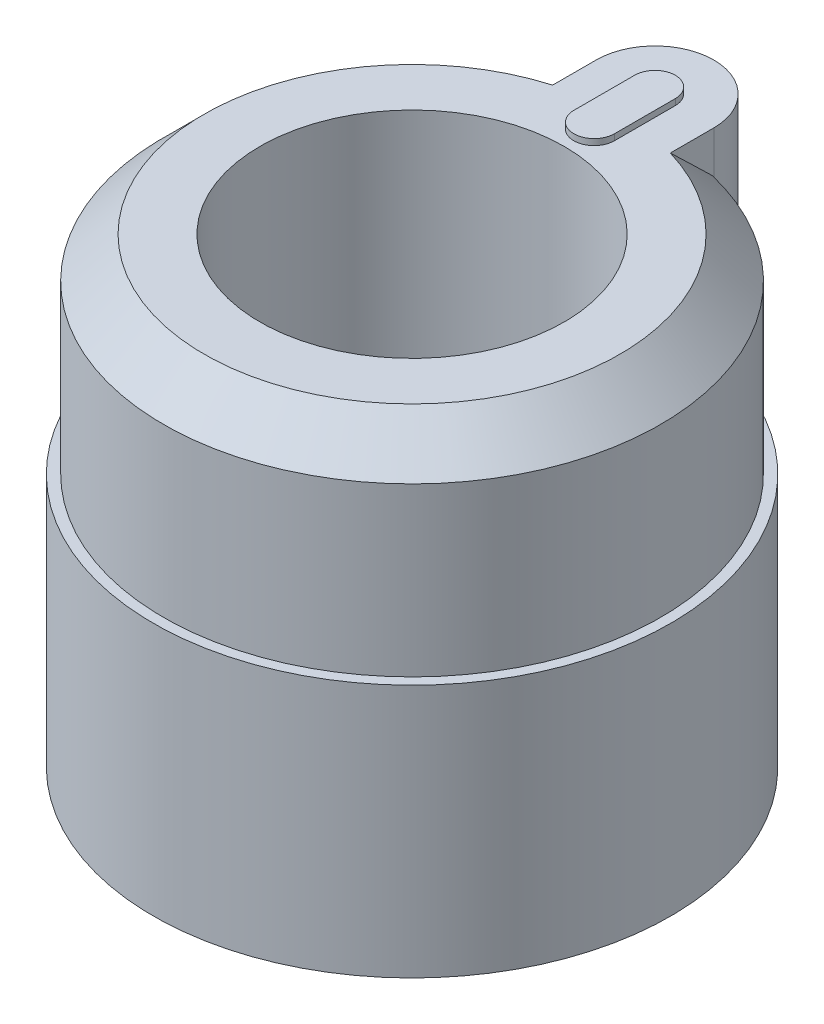
ISO-10303-21;
HEADER;
FILE_DESCRIPTION(('STEP AP214'),'2;1');
FILE_NAME('part.step','',(''),(''),'','','');
FILE_SCHEMA(('AUTOMOTIVE_DESIGN { 1 0 10303 214 1 1 1 1 }'));
ENDSEC;
DATA;
#1=APPLICATION_CONTEXT('core data for automotive mechanical design processes');
#2=APPLICATION_PROTOCOL_DEFINITION('international standard','automotive_design',2000,#1);
#3=PRODUCT_CONTEXT('',#1,'mechanical');
#4=PRODUCT('Part','Part','',(#3));
#5=PRODUCT_RELATED_PRODUCT_CATEGORY('part','',(#4));
#6=PRODUCT_DEFINITION_FORMATION('','',#4);
#7=PRODUCT_DEFINITION_CONTEXT('part definition',#1,'design');
#8=PRODUCT_DEFINITION('design','',#6,#7);
#9=PRODUCT_DEFINITION_SHAPE('','',#8);
#10=(LENGTH_UNIT() NAMED_UNIT(*) SI_UNIT(.MILLI.,.METRE.));
#11=(NAMED_UNIT(*) PLANE_ANGLE_UNIT() SI_UNIT($,.RADIAN.));
#12=(NAMED_UNIT(*) SI_UNIT($,.STERADIAN.) SOLID_ANGLE_UNIT());
#13=UNCERTAINTY_MEASURE_WITH_UNIT(LENGTH_MEASURE(1.E-05),#10,'distance_accuracy_value','');
#14=(GEOMETRIC_REPRESENTATION_CONTEXT(3) GLOBAL_UNCERTAINTY_ASSIGNED_CONTEXT((#13)) GLOBAL_UNIT_ASSIGNED_CONTEXT((#10,
#11,#12)) REPRESENTATION_CONTEXT('',''));
#15=CARTESIAN_POINT('',(0.,0.,0.));
#16=DIRECTION('',(0.,0.,1.));
#17=DIRECTION('',(1.,0.,0.));
#18=AXIS2_PLACEMENT_3D('',#15,#16,#17);
#19=CARTESIAN_POINT('',(0.,34.64,0.));
#20=DIRECTION('',(0.,-1.,0.));
#21=DIRECTION('',(0.,0.,-1.));
#22=AXIS2_PLACEMENT_3D('',#19,#20,#21);
#23=PLANE('',#22);
#24=CARTESIAN_POINT('',(0.,34.64,0.));
#25=DIRECTION('',(0.,-1.,0.));
#26=DIRECTION('',(0.,0.,-1.));
#27=AXIS2_PLACEMENT_3D('',#24,#25,#26);
#28=CIRCLE('',#27,7.49999999999999);
#29=CARTESIAN_POINT('',(0.,34.64,-7.49999999999999));
#30=VERTEX_POINT('',#29);
#31=EDGE_CURVE('E182',#30,#30,#28,.T.);
#32=ORIENTED_EDGE('',*,*,#31,.T.);
#33=EDGE_LOOP('',(#32));
#34=FACE_BOUND('',#33,.T.);
#35=CARTESIAN_POINT('',(0.,34.64,0.));
#36=DIRECTION('',(0.,-1.,0.));
#37=DIRECTION('',(0.,0.,-1.));
#38=AXIS2_PLACEMENT_3D('',#35,#36,#37);
#39=CIRCLE('',#38,10.25);
#40=CARTESIAN_POINT('',(-2.9,34.64,-9.8312003336317));
#41=VERTEX_POINT('',#40);
#42=CARTESIAN_POINT('',(2.9,34.64,-9.8312003336317));
#43=VERTEX_POINT('',#42);
#44=EDGE_CURVE('E186',#41,#43,#39,.F.);
#45=ORIENTED_EDGE('',*,*,#44,.T.);
#46=DIRECTION('',(0.,0.,-1.));
#47=VECTOR('',#46,1.);
#48=CARTESIAN_POINT('',(2.9,34.64,-11.975));
#49=LINE('',#48,#47);
#50=CARTESIAN_POINT('',(2.9,34.64,-11.975));
#51=VERTEX_POINT('',#50);
#52=EDGE_CURVE('E149',#43,#51,#49,.T.);
#53=ORIENTED_EDGE('',*,*,#52,.T.);
#54=CARTESIAN_POINT('',(0.,34.64,-11.975));
#55=DIRECTION('',(0.,1.,0.));
#56=DIRECTION('',(0.,0.,-1.));
#57=AXIS2_PLACEMENT_3D('',#54,#55,#56);
#58=CIRCLE('',#57,2.9);
#59=CARTESIAN_POINT('',(-2.9,34.64,-11.975));
#60=VERTEX_POINT('',#59);
#61=EDGE_CURVE('E151',#51,#60,#58,.T.);
#62=ORIENTED_EDGE('',*,*,#61,.T.);
#63=DIRECTION('',(0.,0.,1.));
#64=VECTOR('',#63,1.);
#65=CARTESIAN_POINT('',(-2.9,34.64,-11.9017855803237));
#66=LINE('',#65,#64);
#67=EDGE_CURVE('E154',#60,#41,#66,.T.);
#68=ORIENTED_EDGE('',*,*,#67,.T.);
#69=EDGE_LOOP('',(#45,#53,#62,#68));
#70=FACE_BOUND('',#69,.T.);
#71=CARTESIAN_POINT('',(0.,34.64,-8.975));
#72=DIRECTION('',(0.,1.,0.));
#73=DIRECTION('',(0.,0.,-1.));
#74=AXIS2_PLACEMENT_3D('',#71,#72,#73);
#75=CIRCLE('',#74,0.999999999999999);
#76=CARTESIAN_POINT('',(-0.999999999999998,34.64,-8.975));
#77=VERTEX_POINT('',#76);
#78=CARTESIAN_POINT('',(1.,34.64,-8.975));
#79=VERTEX_POINT('',#78);
#80=EDGE_CURVE('E139',#77,#79,#75,.T.);
#81=ORIENTED_EDGE('',*,*,#80,.F.);
#82=DIRECTION('',(0.,0.,1.));
#83=VECTOR('',#82,1.);
#84=CARTESIAN_POINT('',(-0.999999999999998,34.64,-8.975));
#85=LINE('',#84,#83);
#86=CARTESIAN_POINT('',(-1.,34.64,-11.975));
#87=VERTEX_POINT('',#86);
#88=EDGE_CURVE('E136',#87,#77,#85,.T.);
#89=ORIENTED_EDGE('',*,*,#88,.F.);
#90=CARTESIAN_POINT('',(0.,34.64,-11.975));
#91=DIRECTION('',(0.,1.,0.));
#92=DIRECTION('',(0.,0.,-1.));
#93=AXIS2_PLACEMENT_3D('',#90,#91,#92);
#94=CIRCLE('',#93,1.);
#95=CARTESIAN_POINT('',(1.,34.64,-11.975));
#96=VERTEX_POINT('',#95);
#97=EDGE_CURVE('E250',#96,#87,#94,.T.);
#98=ORIENTED_EDGE('',*,*,#97,.F.);
#99=DIRECTION('',(0.,0.,-1.));
#100=VECTOR('',#99,1.);
#101=CARTESIAN_POINT('',(1.,34.64,-11.975));
#102=LINE('',#101,#100);
#103=EDGE_CURVE('E243',#79,#96,#102,.T.);
#104=ORIENTED_EDGE('',*,*,#103,.F.);
#105=EDGE_LOOP('',(#81,#89,#98,#104));
#106=FACE_BOUND('',#105,.T.);
#107=ADVANCED_FACE('F34',(#34,#70,#106),#23,.F.);
#108=CARTESIAN_POINT('',(0.,24.4,0.));
#109=DIRECTION('',(0.,-1.,0.));
#110=DIRECTION('',(0.,0.,-1.));
#111=AXIS2_PLACEMENT_3D('',#108,#109,#110);
#112=CYLINDRICAL_SURFACE('',#111,12.75);
#113=CARTESIAN_POINT('',(0.,24.4,0.));
#114=DIRECTION('',(0.,-1.,0.));
#115=DIRECTION('',(0.,0.,-1.));
#116=AXIS2_PLACEMENT_3D('',#113,#114,#115);
#117=CIRCLE('',#116,12.75);
#118=CARTESIAN_POINT('',(2.86504132585668,24.4,-12.4239300626305));
#119=VERTEX_POINT('',#118);
#120=CARTESIAN_POINT('',(-2.86504132585668,24.4,-12.4239300626305));
#121=VERTEX_POINT('',#120);
#122=EDGE_CURVE('E179',#119,#121,#117,.T.);
#123=ORIENTED_EDGE('',*,*,#122,.T.);
#124=EDGE_CURVE('E178',#121,#119,#117,.T.);
#125=ORIENTED_EDGE('',*,*,#124,.T.);
#126=EDGE_LOOP('',(#123,#125));
#127=FACE_BOUND('',#126,.T.);
#128=CARTESIAN_POINT('',(0.,11.9,0.));
#129=DIRECTION('',(0.,-1.,0.));
#130=DIRECTION('',(0.,0.,-1.));
#131=AXIS2_PLACEMENT_3D('',#128,#129,#130);
#132=CIRCLE('',#131,12.75);
#133=CARTESIAN_POINT('',(0.,11.9,-12.75));
#134=VERTEX_POINT('',#133);
#135=EDGE_CURVE('E175',#134,#134,#132,.T.);
#136=ORIENTED_EDGE('',*,*,#135,.F.);
#137=EDGE_LOOP('',(#136));
#138=FACE_BOUND('',#137,.T.);
#139=ADVANCED_FACE('F209',(#127,#138),#112,.T.);
#140=CARTESIAN_POINT('',(12.75,24.4,0.));
#141=DIRECTION('',(0.,1.,0.));
#142=DIRECTION('',(0.,0.,1.));
#143=AXIS2_PLACEMENT_3D('',#140,#141,#142);
#144=PLANE('',#143);
#145=CARTESIAN_POINT('',(0.,24.4,-11.975));
#146=DIRECTION('',(0.,1.,0.));
#147=DIRECTION('',(0.,0.,-1.));
#148=AXIS2_PLACEMENT_3D('',#145,#146,#147);
#149=CIRCLE('',#148,2.9);
#150=CARTESIAN_POINT('',(-2.9,24.4,-11.975));
#151=VERTEX_POINT('',#150);
#152=EDGE_CURVE('E163',#121,#151,#149,.T.);
#153=ORIENTED_EDGE('',*,*,#152,.F.);
#154=ORIENTED_EDGE('',*,*,#122,.F.);
#155=CARTESIAN_POINT('',(2.9,24.4,-11.975));
#156=VERTEX_POINT('',#155);
#157=EDGE_CURVE('E160',#156,#119,#149,.T.);
#158=ORIENTED_EDGE('',*,*,#157,.F.);
#159=DIRECTION('',(0.,0.,-1.));
#160=VECTOR('',#159,1.);
#161=CARTESIAN_POINT('',(2.9,24.4,-11.975));
#162=LINE('',#161,#160);
#163=CARTESIAN_POINT('',(2.9,24.4,-11.9017855803237));
#164=VERTEX_POINT('',#163);
#165=EDGE_CURVE('E143',#164,#156,#162,.T.);
#166=ORIENTED_EDGE('',*,*,#165,.F.);
#167=CARTESIAN_POINT('',(0.,24.4,0.));
#168=DIRECTION('',(0.,1.,0.));
#169=DIRECTION('',(0.,0.,-1.));
#170=AXIS2_PLACEMENT_3D('',#167,#168,#169);
#171=CIRCLE('',#170,12.25);
#172=CARTESIAN_POINT('',(-2.9,24.4,-11.9017855803237));
#173=VERTEX_POINT('',#172);
#174=EDGE_CURVE('E140',#173,#164,#171,.T.);
#175=ORIENTED_EDGE('',*,*,#174,.F.);
#176=DIRECTION('',(0.,0.,1.));
#177=VECTOR('',#176,1.);
#178=CARTESIAN_POINT('',(-2.9,24.4,-11.9017855803237));
#179=LINE('',#178,#177);
#180=EDGE_CURVE('E152',#151,#173,#179,.T.);
#181=ORIENTED_EDGE('',*,*,#180,.F.);
#182=EDGE_LOOP('',(#153,#154,#158,#166,#175,#181));
#183=FACE_BOUND('',#182,.T.);
#184=ADVANCED_FACE('F206',(#183),#144,.T.);
#185=CARTESIAN_POINT('',(0.,11.9,0.));
#186=DIRECTION('',(0.,-1.,0.));
#187=DIRECTION('',(0.,0.,-1.));
#188=AXIS2_PLACEMENT_3D('',#185,#186,#187);
#189=PLANE('',#188);
#190=CARTESIAN_POINT('',(0.,11.9,0.));
#191=DIRECTION('',(0.,-1.,0.));
#192=DIRECTION('',(0.,0.,-1.));
#193=AXIS2_PLACEMENT_3D('',#190,#191,#192);
#194=CIRCLE('',#193,7.49999999999999);
#195=CARTESIAN_POINT('',(0.,11.9,-7.49999999999999));
#196=VERTEX_POINT('',#195);
#197=EDGE_CURVE('E185',#196,#196,#194,.T.);
#198=ORIENTED_EDGE('',*,*,#197,.F.);
#199=EDGE_LOOP('',(#198));
#200=FACE_BOUND('',#199,.T.);
#201=ORIENTED_EDGE('',*,*,#135,.T.);
#202=EDGE_LOOP('',(#201));
#203=FACE_BOUND('',#202,.T.);
#204=ADVANCED_FACE('F203',(#200,#203),#189,.T.);
#205=CARTESIAN_POINT('',(0.,24.4,0.));
#206=DIRECTION('',(0.,-1.,0.));
#207=DIRECTION('',(0.,0.,-1.));
#208=AXIS2_PLACEMENT_3D('',#205,#206,#207);
#209=PLANE('',#208);
#210=ORIENTED_EDGE('',*,*,#124,.F.);
#211=EDGE_CURVE('E159',#119,#121,#149,.T.);
#212=ORIENTED_EDGE('',*,*,#211,.F.);
#213=EDGE_LOOP('',(#210,#212));
#214=FACE_BOUND('',#213,.T.);
#215=ADVANCED_FACE('F202',(#214),#209,.T.);
#216=CARTESIAN_POINT('',(0.,34.64,0.));
#217=DIRECTION('',(0.,-1.,0.));
#218=DIRECTION('',(0.,0.,-1.));
#219=AXIS2_PLACEMENT_3D('',#216,#217,#218);
#220=CYLINDRICAL_SURFACE('',#219,12.25);
#221=DIRECTION('',(0.,-1.,0.));
#222=VECTOR('',#221,1.);
#223=CARTESIAN_POINT('',(2.9,34.64,-11.9017855803237));
#224=LINE('',#223,#222);
#225=CARTESIAN_POINT('',(2.9,32.64,-11.9017855803237));
#226=VERTEX_POINT('',#225);
#227=EDGE_CURVE('E173',#226,#164,#224,.T.);
#228=ORIENTED_EDGE('',*,*,#227,.F.);
#229=CARTESIAN_POINT('',(0.,32.64,0.));
#230=DIRECTION('',(0.,-1.,0.));
#231=DIRECTION('',(0.,0.,-1.));
#232=AXIS2_PLACEMENT_3D('',#229,#230,#231);
#233=CIRCLE('',#232,12.25);
#234=CARTESIAN_POINT('',(-2.9,32.64,-11.9017855803237));
#235=VERTEX_POINT('',#234);
#236=EDGE_CURVE('E54',#226,#235,#233,.T.);
#237=ORIENTED_EDGE('',*,*,#236,.T.);
#238=DIRECTION('',(0.,-1.,0.));
#239=VECTOR('',#238,1.);
#240=CARTESIAN_POINT('',(-2.9,34.64,-11.9017855803237));
#241=LINE('',#240,#239);
#242=EDGE_CURVE('E155',#235,#173,#241,.T.);
#243=ORIENTED_EDGE('',*,*,#242,.T.);
#244=ORIENTED_EDGE('',*,*,#174,.T.);
#245=EDGE_LOOP('',(#228,#237,#243,#244));
#246=FACE_BOUND('',#245,.T.);
#247=ADVANCED_FACE('F199',(#246),#220,.T.);
#248=CARTESIAN_POINT('',(2.9,34.64,-11.975));
#249=DIRECTION('',(-1.,0.,0.));
#250=DIRECTION('',(0.,0.,1.));
#251=AXIS2_PLACEMENT_3D('',#248,#249,#250);
#252=PLANE('',#251);
#253=ORIENTED_EDGE('',*,*,#165,.T.);
#254=DIRECTION('',(0.,-1.,0.));
#255=VECTOR('',#254,1.);
#256=CARTESIAN_POINT('',(2.9,34.64,-11.975));
#257=LINE('',#256,#255);
#258=EDGE_CURVE('E170',#51,#156,#257,.T.);
#259=ORIENTED_EDGE('',*,*,#258,.F.);
#260=ORIENTED_EDGE('',*,*,#52,.F.);
#261=CARTESIAN_POINT('',(2.9,34.64,-9.8312003336317));
#262=CARTESIAN_POINT('',(2.9,34.4739385214876,-10.0043328192131));
#263=CARTESIAN_POINT('',(2.9,34.3076973358327,-10.1772927684095));
#264=CARTESIAN_POINT('',(2.9,33.9748998352188,-10.5229083994769));
#265=CARTESIAN_POINT('',(2.9,33.8083435210659,-10.6955640821242));
#266=CARTESIAN_POINT('',(2.9,33.474959304048,-11.0406127615282));
#267=CARTESIAN_POINT('',(2.9,33.3081314013534,-11.2130057584499));
#268=CARTESIAN_POINT('',(2.9,32.9742365806329,-11.5575609989808));
#269=CARTESIAN_POINT('',(2.9,32.8071696619982,-11.7297232420002));
#270=CARTESIAN_POINT('',(2.9,32.64,-11.9017855803237));
#271=B_SPLINE_CURVE_WITH_KNOTS('',3,(#261,#262,#263,#264,#265,#266,#267,#268,#269,#270),
.UNSPECIFIED.,.F.,.F.,(4,2,2,2,4),(0.,0.719695082452588,1.43938832606504,2.15908111788268,
2.87877574589828),.UNSPECIFIED.);
#272=EDGE_CURVE('E47',#43,#226,#271,.T.);
#273=ORIENTED_EDGE('',*,*,#272,.T.);
#274=ORIENTED_EDGE('',*,*,#227,.T.);
#275=EDGE_LOOP('',(#253,#259,#260,#273,#274));
#276=FACE_BOUND('',#275,.T.);
#277=ADVANCED_FACE('F193',(#276),#252,.F.);
#278=CARTESIAN_POINT('',(0.,34.64,-11.975));
#279=DIRECTION('',(0.,-1.,0.));
#280=DIRECTION('',(0.,0.,-1.));
#281=AXIS2_PLACEMENT_3D('',#278,#279,#280);
#282=CYLINDRICAL_SURFACE('',#281,2.9);
#283=ORIENTED_EDGE('',*,*,#157,.T.);
#284=ORIENTED_EDGE('',*,*,#211,.T.);
#285=ORIENTED_EDGE('',*,*,#152,.T.);
#286=DIRECTION('',(0.,-1.,0.));
#287=VECTOR('',#286,1.);
#288=CARTESIAN_POINT('',(-2.9,34.64,-11.975));
#289=LINE('',#288,#287);
#290=EDGE_CURVE('E167',#60,#151,#289,.T.);
#291=ORIENTED_EDGE('',*,*,#290,.F.);
#292=ORIENTED_EDGE('',*,*,#61,.F.);
#293=ORIENTED_EDGE('',*,*,#258,.T.);
#294=EDGE_LOOP('',(#283,#284,#285,#291,#292,#293));
#295=FACE_BOUND('',#294,.T.);
#296=ADVANCED_FACE('F198',(#295),#282,.T.);
#297=CARTESIAN_POINT('',(-2.9,34.64,-11.9017855803237));
#298=DIRECTION('',(1.,0.,0.));
#299=DIRECTION('',(0.,0.,-1.));
#300=AXIS2_PLACEMENT_3D('',#297,#298,#299);
#301=PLANE('',#300);
#302=ORIENTED_EDGE('',*,*,#180,.T.);
#303=ORIENTED_EDGE('',*,*,#242,.F.);
#304=CARTESIAN_POINT('',(-2.9,32.64,-11.9017855803237));
#305=CARTESIAN_POINT('',(-2.9,32.8071696619982,-11.7297232420002));
#306=CARTESIAN_POINT('',(-2.9,32.9742365806329,-11.5575609989808));
#307=CARTESIAN_POINT('',(-2.9,33.3081314013534,-11.2130057584499));
#308=CARTESIAN_POINT('',(-2.9,33.474959304048,-11.0406127615282));
#309=CARTESIAN_POINT('',(-2.9,33.8083435210659,-10.6955640821242));
#310=CARTESIAN_POINT('',(-2.9,33.9748998352188,-10.5229083994769));
#311=CARTESIAN_POINT('',(-2.9,34.3076973358327,-10.1772927684095));
#312=CARTESIAN_POINT('',(-2.9,34.4739385214876,-10.0043328192131));
#313=CARTESIAN_POINT('',(-2.9,34.64,-9.8312003336317));
#314=B_SPLINE_CURVE_WITH_KNOTS('',3,(#304,#305,#306,#307,#308,#309,#310,#311,#312,#313),
.UNSPECIFIED.,.F.,.F.,(4,2,2,2,4),(0.,0.719694628015598,1.43938741983323,2.15908066344569,
2.87877574589828),.UNSPECIFIED.);
#315=EDGE_CURVE('E11',#235,#41,#314,.T.);
#316=ORIENTED_EDGE('',*,*,#315,.T.);
#317=ORIENTED_EDGE('',*,*,#67,.F.);
#318=ORIENTED_EDGE('',*,*,#290,.T.);
#319=EDGE_LOOP('',(#302,#303,#316,#317,#318));
#320=FACE_BOUND('',#319,.T.);
#321=ADVANCED_FACE('F238',(#320),#301,.F.);
#322=CARTESIAN_POINT('',(0.,34.94,-8.975));
#323=DIRECTION('',(0.,-1.,0.));
#324=DIRECTION('',(0.,0.,-1.));
#325=AXIS2_PLACEMENT_3D('',#322,#323,#324);
#326=CYLINDRICAL_SURFACE('',#325,0.999999999999999);
#327=ORIENTED_EDGE('',*,*,#80,.T.);
#328=DIRECTION('',(0.,-1.,0.));
#329=VECTOR('',#328,1.);
#330=CARTESIAN_POINT('',(1.,34.94,-8.975));
#331=LINE('',#330,#329);
#332=CARTESIAN_POINT('',(1.,34.94,-8.975));
#333=VERTEX_POINT('',#332);
#334=EDGE_CURVE('E120',#333,#79,#331,.T.);
#335=ORIENTED_EDGE('',*,*,#334,.F.);
#336=CARTESIAN_POINT('',(0.,34.94,-8.975));
#337=DIRECTION('',(0.,1.,0.));
#338=DIRECTION('',(0.,0.,-1.));
#339=AXIS2_PLACEMENT_3D('',#336,#337,#338);
#340=CIRCLE('',#339,0.999999999999999);
#341=CARTESIAN_POINT('',(-0.999999999999998,34.94,-8.975));
#342=VERTEX_POINT('',#341);
#343=EDGE_CURVE('E127',#342,#333,#340,.T.);
#344=ORIENTED_EDGE('',*,*,#343,.F.);
#345=DIRECTION('',(0.,-1.,0.));
#346=VECTOR('',#345,1.);
#347=CARTESIAN_POINT('',(-0.999999999999998,34.94,-8.975));
#348=LINE('',#347,#346);
#349=EDGE_CURVE('E248',#342,#77,#348,.T.);
#350=ORIENTED_EDGE('',*,*,#349,.T.);
#351=EDGE_LOOP('',(#327,#335,#344,#350));
#352=FACE_BOUND('',#351,.T.);
#353=ADVANCED_FACE('F138',(#352),#326,.T.);
#354=CARTESIAN_POINT('',(1.,34.94,-11.975));
#355=DIRECTION('',(-1.,0.,0.));
#356=DIRECTION('',(0.,0.,1.));
#357=AXIS2_PLACEMENT_3D('',#354,#355,#356);
#358=PLANE('',#357);
#359=ORIENTED_EDGE('',*,*,#103,.T.);
#360=DIRECTION('',(0.,-1.,0.));
#361=VECTOR('',#360,1.);
#362=CARTESIAN_POINT('',(1.,34.94,-11.975));
#363=LINE('',#362,#361);
#364=CARTESIAN_POINT('',(1.,34.94,-11.975));
#365=VERTEX_POINT('',#364);
#366=EDGE_CURVE('E123',#365,#96,#363,.T.);
#367=ORIENTED_EDGE('',*,*,#366,.F.);
#368=DIRECTION('',(0.,0.,-1.));
#369=VECTOR('',#368,1.);
#370=CARTESIAN_POINT('',(1.,34.94,-11.975));
#371=LINE('',#370,#369);
#372=EDGE_CURVE('E115',#333,#365,#371,.T.);
#373=ORIENTED_EDGE('',*,*,#372,.F.);
#374=ORIENTED_EDGE('',*,*,#334,.T.);
#375=EDGE_LOOP('',(#359,#367,#373,#374));
#376=FACE_BOUND('',#375,.T.);
#377=ADVANCED_FACE('F118',(#376),#358,.F.);
#378=CARTESIAN_POINT('',(0.,34.94,-11.975));
#379=DIRECTION('',(0.,-1.,0.));
#380=DIRECTION('',(0.,0.,-1.));
#381=AXIS2_PLACEMENT_3D('',#378,#379,#380);
#382=CYLINDRICAL_SURFACE('',#381,1.);
#383=ORIENTED_EDGE('',*,*,#97,.T.);
#384=DIRECTION('',(0.,-1.,0.));
#385=VECTOR('',#384,1.);
#386=CARTESIAN_POINT('',(-1.,34.94,-11.975));
#387=LINE('',#386,#385);
#388=CARTESIAN_POINT('',(-1.,34.94,-11.975));
#389=VERTEX_POINT('',#388);
#390=EDGE_CURVE('E145',#389,#87,#387,.T.);
#391=ORIENTED_EDGE('',*,*,#390,.F.);
#392=CARTESIAN_POINT('',(0.,34.94,-11.975));
#393=DIRECTION('',(0.,1.,0.));
#394=DIRECTION('',(0.,0.,-1.));
#395=AXIS2_PLACEMENT_3D('',#392,#393,#394);
#396=CIRCLE('',#395,1.);
#397=EDGE_CURVE('E126',#365,#389,#396,.T.);
#398=ORIENTED_EDGE('',*,*,#397,.F.);
#399=ORIENTED_EDGE('',*,*,#366,.T.);
#400=EDGE_LOOP('',(#383,#391,#398,#399));
#401=FACE_BOUND('',#400,.T.);
#402=ADVANCED_FACE('F274',(#401),#382,.T.);
#403=CARTESIAN_POINT('',(-0.999999999999998,34.94,-8.975));
#404=DIRECTION('',(1.,0.,0.));
#405=DIRECTION('',(0.,0.,-1.));
#406=AXIS2_PLACEMENT_3D('',#403,#404,#405);
#407=PLANE('',#406);
#408=ORIENTED_EDGE('',*,*,#88,.T.);
#409=ORIENTED_EDGE('',*,*,#349,.F.);
#410=DIRECTION('',(0.,0.,1.));
#411=VECTOR('',#410,1.);
#412=CARTESIAN_POINT('',(-0.999999999999998,34.94,-8.975));
#413=LINE('',#412,#411);
#414=EDGE_CURVE('E132',#389,#342,#413,.T.);
#415=ORIENTED_EDGE('',*,*,#414,.F.);
#416=ORIENTED_EDGE('',*,*,#390,.T.);
#417=EDGE_LOOP('',(#408,#409,#415,#416));
#418=FACE_BOUND('',#417,.T.);
#419=ADVANCED_FACE('F247',(#418),#407,.F.);
#420=CARTESIAN_POINT('',(0.,34.94,-8.975));
#421=DIRECTION('',(0.,-1.,0.));
#422=DIRECTION('',(0.,0.,-1.));
#423=AXIS2_PLACEMENT_3D('',#420,#421,#422);
#424=PLANE('',#423);
#425=ORIENTED_EDGE('',*,*,#343,.T.);
#426=ORIENTED_EDGE('',*,*,#372,.T.);
#427=ORIENTED_EDGE('',*,*,#397,.T.);
#428=ORIENTED_EDGE('',*,*,#414,.T.);
#429=EDGE_LOOP('',(#425,#426,#427,#428));
#430=FACE_BOUND('',#429,.T.);
#431=ADVANCED_FACE('F130',(#430),#424,.F.);
#432=CARTESIAN_POINT('',(0.,11.9,0.));
#433=DIRECTION('',(0.,-1.,0.));
#434=DIRECTION('',(0.,0.,-1.));
#435=AXIS2_PLACEMENT_3D('',#432,#433,#434);
#436=CYLINDRICAL_SURFACE('',#435,7.49999999999999);
#437=ORIENTED_EDGE('',*,*,#197,.T.);
#438=EDGE_LOOP('',(#437));
#439=FACE_BOUND('',#438,.T.);
#440=ORIENTED_EDGE('',*,*,#31,.F.);
#441=EDGE_LOOP('',(#440));
#442=FACE_BOUND('',#441,.T.);
#443=ADVANCED_FACE('F261',(#439,#442),#436,.F.);
#444=CARTESIAN_POINT('',(0.,34.64,0.));
#445=DIRECTION('',(0.,-1.,0.));
#446=DIRECTION('',(0.,0.,-1.));
#447=AXIS2_PLACEMENT_3D('',#444,#445,#446);
#448=CONICAL_SURFACE('',#447,10.25,0.785398163397446);
#449=ORIENTED_EDGE('',*,*,#315,.F.);
#450=ORIENTED_EDGE('',*,*,#236,.F.);
#451=ORIENTED_EDGE('',*,*,#272,.F.);
#452=ORIENTED_EDGE('',*,*,#44,.F.);
#453=EDGE_LOOP('',(#449,#450,#451,#452));
#454=FACE_BOUND('',#453,.T.);
#455=ADVANCED_FACE('F36',(#454),#448,.T.);
#456=CLOSED_SHELL('',(#107,#139,#184,#204,#215,#247,#277,#296,#321,#353,#377,#402,#419,#431,
#443,#455));
#457=MANIFOLD_SOLID_BREP('B2',#456);
#458=ADVANCED_BREP_SHAPE_REPRESENTATION('',(#18,#457),#14);
#459=SHAPE_DEFINITION_REPRESENTATION(#9,#458);
ENDSEC;
END-ISO-10303-21;
